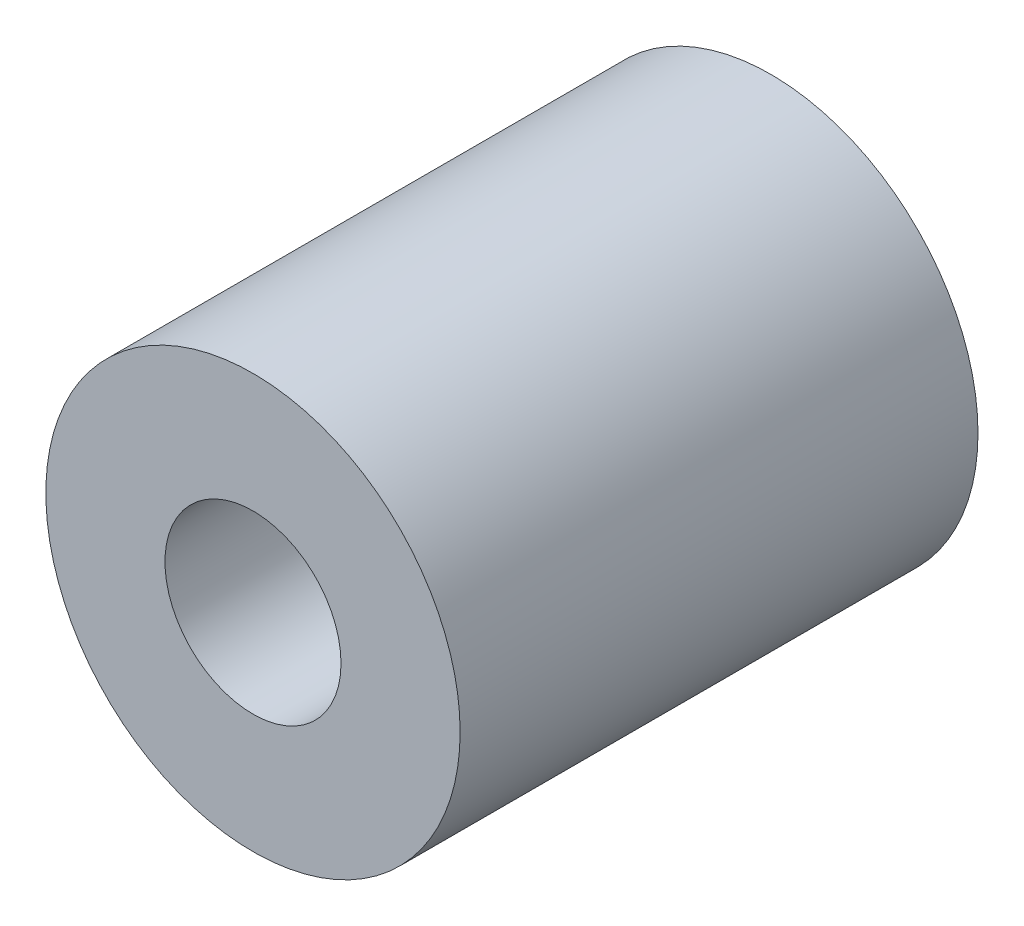
ISO-10303-21;
HEADER;
FILE_DESCRIPTION(('STEP AP214'),'2;1');
FILE_NAME('part.step','',(''),(''),'','','');
FILE_SCHEMA(('AUTOMOTIVE_DESIGN { 1 0 10303 214 1 1 1 1 }'));
ENDSEC;
DATA;
#1=APPLICATION_CONTEXT('core data for automotive mechanical design processes');
#2=APPLICATION_PROTOCOL_DEFINITION('international standard','automotive_design',2000,#1);
#3=PRODUCT_CONTEXT('',#1,'mechanical');
#4=PRODUCT('Part','Part','',(#3));
#5=PRODUCT_RELATED_PRODUCT_CATEGORY('part','',(#4));
#6=PRODUCT_DEFINITION_FORMATION('','',#4);
#7=PRODUCT_DEFINITION_CONTEXT('part definition',#1,'design');
#8=PRODUCT_DEFINITION('design','',#6,#7);
#9=PRODUCT_DEFINITION_SHAPE('','',#8);
#10=(LENGTH_UNIT() NAMED_UNIT(*) SI_UNIT(.MILLI.,.METRE.));
#11=(NAMED_UNIT(*) PLANE_ANGLE_UNIT() SI_UNIT($,.RADIAN.));
#12=(NAMED_UNIT(*) SI_UNIT($,.STERADIAN.) SOLID_ANGLE_UNIT());
#13=UNCERTAINTY_MEASURE_WITH_UNIT(LENGTH_MEASURE(1.E-05),#10,'distance_accuracy_value','');
#14=(GEOMETRIC_REPRESENTATION_CONTEXT(3) GLOBAL_UNCERTAINTY_ASSIGNED_CONTEXT((#13)) GLOBAL_UNIT_ASSIGNED_CONTEXT((#10,
#11,#12)) REPRESENTATION_CONTEXT('',''));
#15=CARTESIAN_POINT('',(0.,0.,0.));
#16=DIRECTION('',(0.,0.,1.));
#17=DIRECTION('',(1.,0.,0.));
#18=AXIS2_PLACEMENT_3D('',#15,#16,#17);
#19=CARTESIAN_POINT('',(0.,0.,10.));
#20=DIRECTION('',(0.,0.,1.));
#21=DIRECTION('',(1.,0.,0.));
#22=AXIS2_PLACEMENT_3D('',#19,#20,#21);
#23=PLANE('',#22);
#24=CARTESIAN_POINT('',(0.,0.,10.));
#25=DIRECTION('',(0.,0.,1.));
#26=DIRECTION('',(1.,0.,0.));
#27=AXIS2_PLACEMENT_3D('',#24,#25,#26);
#28=CIRCLE('',#27,4.);
#29=CARTESIAN_POINT('',(4.,0.,10.));
#30=VERTEX_POINT('',#29);
#31=EDGE_CURVE('E10',#30,#30,#28,.T.);
#32=ORIENTED_EDGE('',*,*,#31,.T.);
#33=EDGE_LOOP('',(#32));
#34=FACE_BOUND('',#33,.T.);
#35=CARTESIAN_POINT('',(0.,0.,10.));
#36=DIRECTION('',(0.,0.,1.));
#37=DIRECTION('',(1.,0.,0.));
#38=AXIS2_PLACEMENT_3D('',#35,#36,#37);
#39=CIRCLE('',#38,1.7);
#40=CARTESIAN_POINT('',(1.7,0.,10.));
#41=VERTEX_POINT('',#40);
#42=EDGE_CURVE('E50',#41,#41,#39,.T.);
#43=ORIENTED_EDGE('',*,*,#42,.F.);
#44=EDGE_LOOP('',(#43));
#45=FACE_BOUND('',#44,.T.);
#46=ADVANCED_FACE('F37',(#34,#45),#23,.T.);
#47=CARTESIAN_POINT('',(0.,0.,0.));
#48=DIRECTION('',(0.,0.,1.));
#49=DIRECTION('',(1.,0.,0.));
#50=AXIS2_PLACEMENT_3D('',#47,#48,#49);
#51=PLANE('',#50);
#52=CARTESIAN_POINT('',(0.,0.,0.));
#53=DIRECTION('',(0.,0.,1.));
#54=DIRECTION('',(1.,0.,0.));
#55=AXIS2_PLACEMENT_3D('',#52,#53,#54);
#56=CIRCLE('',#55,4.);
#57=CARTESIAN_POINT('',(4.,0.,0.));
#58=VERTEX_POINT('',#57);
#59=EDGE_CURVE('E41',#58,#58,#56,.T.);
#60=ORIENTED_EDGE('',*,*,#59,.F.);
#61=EDGE_LOOP('',(#60));
#62=FACE_BOUND('',#61,.T.);
#63=CARTESIAN_POINT('',(0.,0.,0.));
#64=DIRECTION('',(0.,0.,1.));
#65=DIRECTION('',(1.,0.,0.));
#66=AXIS2_PLACEMENT_3D('',#63,#64,#65);
#67=CIRCLE('',#66,1.7);
#68=CARTESIAN_POINT('',(1.7,0.,0.));
#69=VERTEX_POINT('',#68);
#70=EDGE_CURVE('E52',#69,#69,#67,.T.);
#71=ORIENTED_EDGE('',*,*,#70,.T.);
#72=EDGE_LOOP('',(#71));
#73=FACE_BOUND('',#72,.T.);
#74=ADVANCED_FACE('F64',(#62,#73),#51,.F.);
#75=CARTESIAN_POINT('',(0.,0.,10.));
#76=DIRECTION('',(0.,0.,-1.));
#77=DIRECTION('',(-1.,0.,0.));
#78=AXIS2_PLACEMENT_3D('',#75,#76,#77);
#79=CYLINDRICAL_SURFACE('',#78,4.);
#80=ORIENTED_EDGE('',*,*,#31,.F.);
#81=EDGE_LOOP('',(#80));
#82=FACE_BOUND('',#81,.T.);
#83=ORIENTED_EDGE('',*,*,#59,.T.);
#84=EDGE_LOOP('',(#83));
#85=FACE_BOUND('',#84,.T.);
#86=ADVANCED_FACE('F39',(#82,#85),#79,.T.);
#87=CARTESIAN_POINT('',(0.,0.,10.));
#88=DIRECTION('',(0.,0.,-1.));
#89=DIRECTION('',(-1.,0.,0.));
#90=AXIS2_PLACEMENT_3D('',#87,#88,#89);
#91=CYLINDRICAL_SURFACE('',#90,1.7);
#92=ORIENTED_EDGE('',*,*,#42,.T.);
#93=EDGE_LOOP('',(#92));
#94=FACE_BOUND('',#93,.T.);
#95=ORIENTED_EDGE('',*,*,#70,.F.);
#96=EDGE_LOOP('',(#95));
#97=FACE_BOUND('',#96,.T.);
#98=ADVANCED_FACE('F60',(#94,#97),#91,.F.);
#99=CLOSED_SHELL('',(#46,#74,#86,#98));
#100=MANIFOLD_SOLID_BREP('B2',#99);
#101=ADVANCED_BREP_SHAPE_REPRESENTATION('',(#18,#100),#14);
#102=SHAPE_DEFINITION_REPRESENTATION(#9,#101);
ENDSEC;
END-ISO-10303-21;
